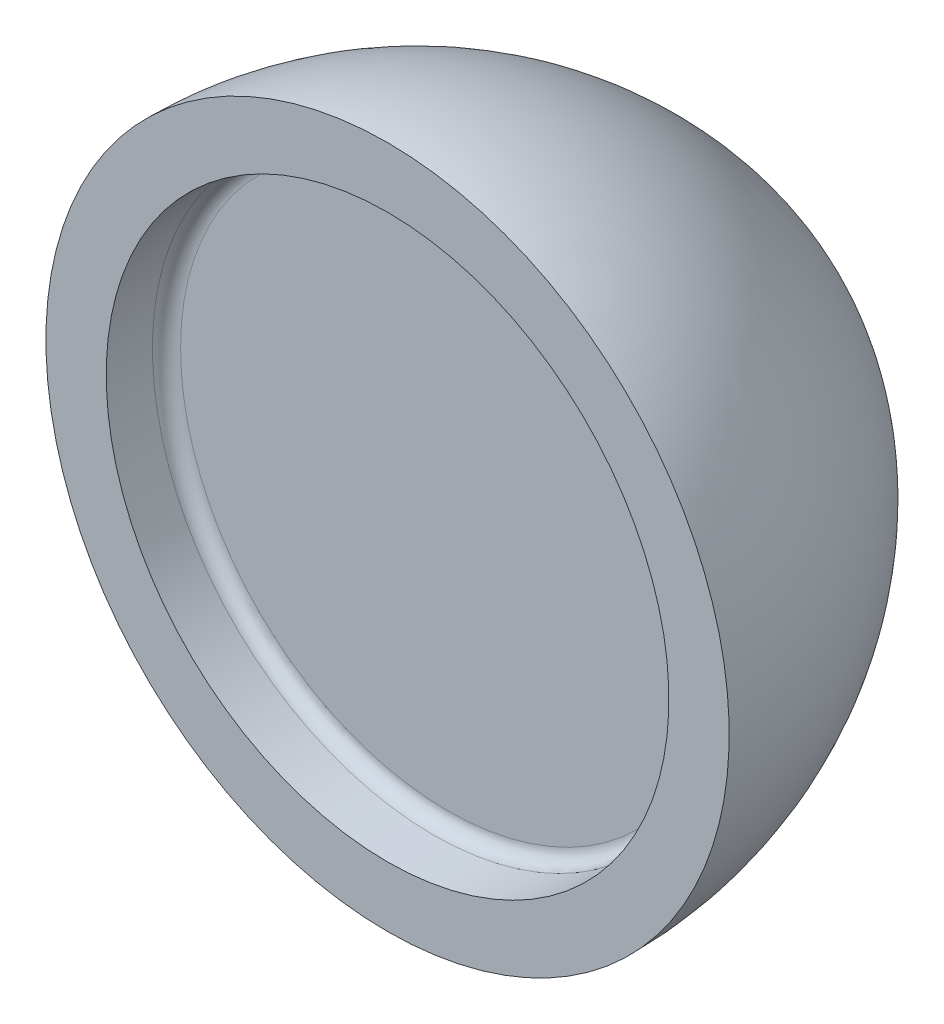
ISO-10303-21;
HEADER;
FILE_DESCRIPTION(('STEP AP214'),'2;1');
FILE_NAME('part.step','',(''),(''),'','','');
FILE_SCHEMA(('AUTOMOTIVE_DESIGN { 1 0 10303 214 1 1 1 1 }'));
ENDSEC;
DATA;
#1=APPLICATION_CONTEXT('core data for automotive mechanical design processes');
#2=APPLICATION_PROTOCOL_DEFINITION('international standard','automotive_design',2000,#1);
#3=PRODUCT_CONTEXT('',#1,'mechanical');
#4=PRODUCT('Part','Part','',(#3));
#5=PRODUCT_RELATED_PRODUCT_CATEGORY('part','',(#4));
#6=PRODUCT_DEFINITION_FORMATION('','',#4);
#7=PRODUCT_DEFINITION_CONTEXT('part definition',#1,'design');
#8=PRODUCT_DEFINITION('design','',#6,#7);
#9=PRODUCT_DEFINITION_SHAPE('','',#8);
#10=(LENGTH_UNIT() NAMED_UNIT(*) SI_UNIT(.MILLI.,.METRE.));
#11=(NAMED_UNIT(*) PLANE_ANGLE_UNIT() SI_UNIT($,.RADIAN.));
#12=(NAMED_UNIT(*) SI_UNIT($,.STERADIAN.) SOLID_ANGLE_UNIT());
#13=UNCERTAINTY_MEASURE_WITH_UNIT(LENGTH_MEASURE(1.E-05),#10,'distance_accuracy_value','');
#14=(GEOMETRIC_REPRESENTATION_CONTEXT(3) GLOBAL_UNCERTAINTY_ASSIGNED_CONTEXT((#13)) GLOBAL_UNIT_ASSIGNED_CONTEXT((#10,
#11,#12)) REPRESENTATION_CONTEXT('',''));
#15=CARTESIAN_POINT('',(0.,0.,0.));
#16=DIRECTION('',(0.,0.,1.));
#17=DIRECTION('',(1.,0.,0.));
#18=AXIS2_PLACEMENT_3D('',#15,#16,#17);
#19=CARTESIAN_POINT('',(0.,3.26470588235297,0.));
#20=DIRECTION('',(-1.,0.,0.));
#21=DIRECTION('',(0.,-1.,0.));
#22=AXIS2_PLACEMENT_3D('',#19,#20,#21);
#23=CIRCLE('',#22,20.2647058823529);
#24=TRIMMED_CURVE('',#23,(PARAMETER_VALUE(-1.40898812848443)),
(PARAMETER_VALUE(1.40898812848443)),.T.,.PARAMETER.);
#25=CARTESIAN_POINT('',(0.,0.,0.));
#26=DIRECTION('',(0.,0.,1.));
#27=AXIS1_PLACEMENT('',#25,#26);
#28=SURFACE_OF_REVOLUTION('',#24,#27);
#29=CARTESIAN_POINT('',(0.,0.,0.));
#30=DIRECTION('',(0.,0.,1.));
#31=DIRECTION('',(0.,-1.,0.));
#32=AXIS2_PLACEMENT_3D('',#29,#30,#31);
#33=CIRCLE('',#32,17.);
#34=CARTESIAN_POINT('',(0.,-17.,0.));
#35=VERTEX_POINT('',#34);
#36=EDGE_CURVE('E74',#35,#35,#33,.T.);
#37=ORIENTED_EDGE('',*,*,#36,.F.);
#38=EDGE_LOOP('',(#37));
#39=FACE_BOUND('',#38,.T.);
#40=CARTESIAN_POINT('',(0.,0.,-20.));
#41=VERTEX_POINT('',#40);
#42=VERTEX_LOOP('',#41);
#43=FACE_BOUND('',#42,.T.);
#44=ADVANCED_FACE('F40',(#39,#43),#28,.T.);
#45=CARTESIAN_POINT('',(0.,0.,0.));
#46=DIRECTION('',(0.,0.,-1.));
#47=DIRECTION('',(0.,1.,0.));
#48=AXIS2_PLACEMENT_3D('',#45,#46,#47);
#49=PLANE('',#48);
#50=CARTESIAN_POINT('',(0.,0.,0.));
#51=DIRECTION('',(0.,0.,1.));
#52=DIRECTION('',(0.,-1.,0.));
#53=AXIS2_PLACEMENT_3D('',#50,#51,#52);
#54=CIRCLE('',#53,14.);
#55=CARTESIAN_POINT('',(0.,-14.,0.));
#56=VERTEX_POINT('',#55);
#57=EDGE_CURVE('E76',#56,#56,#54,.T.);
#58=ORIENTED_EDGE('',*,*,#57,.F.);
#59=EDGE_LOOP('',(#58));
#60=FACE_BOUND('',#59,.T.);
#61=ORIENTED_EDGE('',*,*,#36,.T.);
#62=EDGE_LOOP('',(#61));
#63=FACE_BOUND('',#62,.T.);
#64=ADVANCED_FACE('F51',(#60,#63),#49,.F.);
#65=CARTESIAN_POINT('',(0.,0.,-3.));
#66=DIRECTION('',(0.,0.,1.));
#67=DIRECTION('',(0.,-1.,0.));
#68=AXIS2_PLACEMENT_3D('',#65,#66,#67);
#69=CYLINDRICAL_SURFACE('',#68,14.);
#70=CARTESIAN_POINT('',(0.,0.,-2.3));
#71=DIRECTION('',(0.,0.,-1.));
#72=DIRECTION('',(0.,1.,0.));
#73=AXIS2_PLACEMENT_3D('',#70,#71,#72);
#74=CIRCLE('',#73,14.);
#75=CARTESIAN_POINT('',(0.,14.,-2.30000000000001));
#76=VERTEX_POINT('',#75);
#77=EDGE_CURVE('E11',#76,#76,#74,.T.);
#78=ORIENTED_EDGE('',*,*,#77,.T.);
#79=EDGE_LOOP('',(#78));
#80=FACE_BOUND('',#79,.T.);
#81=ORIENTED_EDGE('',*,*,#57,.T.);
#82=EDGE_LOOP('',(#81));
#83=FACE_BOUND('',#82,.T.);
#84=ADVANCED_FACE('F56',(#80,#83),#69,.F.);
#85=CARTESIAN_POINT('',(0.,0.,-3.));
#86=DIRECTION('',(0.,0.,-1.));
#87=DIRECTION('',(0.,1.,0.));
#88=AXIS2_PLACEMENT_3D('',#85,#86,#87);
#89=PLANE('',#88);
#90=CARTESIAN_POINT('',(0.,0.,-3.));
#91=DIRECTION('',(0.,0.,-1.));
#92=DIRECTION('',(0.,1.,0.));
#93=AXIS2_PLACEMENT_3D('',#90,#91,#92);
#94=CIRCLE('',#93,13.3);
#95=CARTESIAN_POINT('',(0.,13.3,-3.00000000000001));
#96=VERTEX_POINT('',#95);
#97=EDGE_CURVE('E47',#96,#96,#94,.F.);
#98=ORIENTED_EDGE('',*,*,#97,.T.);
#99=EDGE_LOOP('',(#98));
#100=FACE_BOUND('',#99,.T.);
#101=ADVANCED_FACE('F63',(#100),#89,.F.);
#102=CARTESIAN_POINT('',(0.,0.,-2.3));
#103=DIRECTION('',(0.,0.,-1.));
#104=DIRECTION('',(0.,1.,0.));
#105=AXIS2_PLACEMENT_3D('',#102,#103,#104);
#106=TOROIDAL_SURFACE('',#105,13.3,0.7);
#107=ORIENTED_EDGE('',*,*,#77,.F.);
#108=EDGE_LOOP('',(#107));
#109=FACE_BOUND('',#108,.T.);
#110=ORIENTED_EDGE('',*,*,#97,.F.);
#111=EDGE_LOOP('',(#110));
#112=FACE_BOUND('',#111,.T.);
#113=ADVANCED_FACE('F42',(#109,#112),#106,.F.);
#114=CLOSED_SHELL('',(#44,#64,#84,#101,#113));
#115=MANIFOLD_SOLID_BREP('B2',#114);
#116=ADVANCED_BREP_SHAPE_REPRESENTATION('',(#18,#115),#14);
#117=SHAPE_DEFINITION_REPRESENTATION(#9,#116);
ENDSEC;
END-ISO-10303-21;
